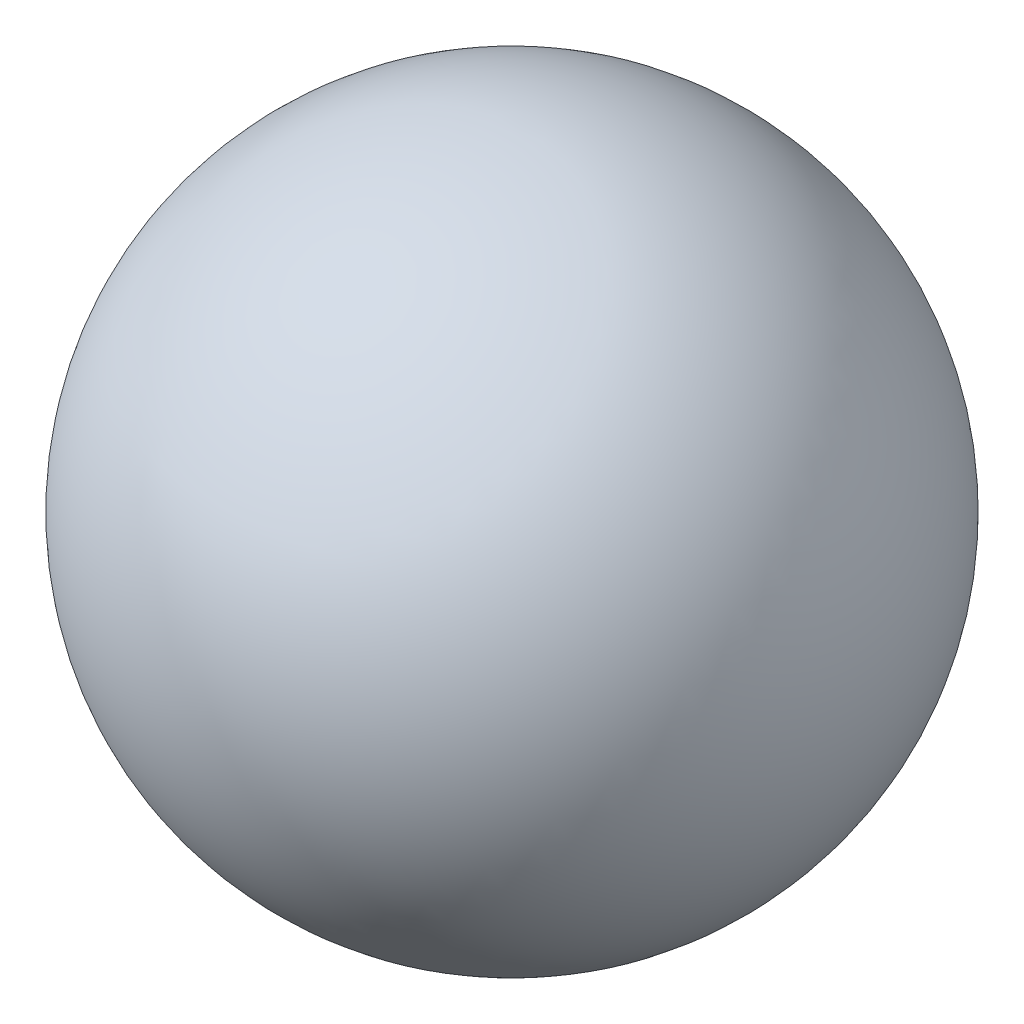
ISO-10303-21;
HEADER;
FILE_DESCRIPTION(('STEP AP214'),'2;1');
FILE_NAME('part.step','',(''),(''),'','','');
FILE_SCHEMA(('AUTOMOTIVE_DESIGN { 1 0 10303 214 1 1 1 1 }'));
ENDSEC;
DATA;
#1=APPLICATION_CONTEXT('core data for automotive mechanical design processes');
#2=APPLICATION_PROTOCOL_DEFINITION('international standard','automotive_design',2000,#1);
#3=PRODUCT_CONTEXT('',#1,'mechanical');
#4=PRODUCT('Part','Part','',(#3));
#5=PRODUCT_RELATED_PRODUCT_CATEGORY('part','',(#4));
#6=PRODUCT_DEFINITION_FORMATION('','',#4);
#7=PRODUCT_DEFINITION_CONTEXT('part definition',#1,'design');
#8=PRODUCT_DEFINITION('design','',#6,#7);
#9=PRODUCT_DEFINITION_SHAPE('','',#8);
#10=(LENGTH_UNIT() NAMED_UNIT(*) SI_UNIT(.MILLI.,.METRE.));
#11=(NAMED_UNIT(*) PLANE_ANGLE_UNIT() SI_UNIT($,.RADIAN.));
#12=(NAMED_UNIT(*) SI_UNIT($,.STERADIAN.) SOLID_ANGLE_UNIT());
#13=UNCERTAINTY_MEASURE_WITH_UNIT(LENGTH_MEASURE(1.E-05),#10,'distance_accuracy_value','');
#14=(GEOMETRIC_REPRESENTATION_CONTEXT(3) GLOBAL_UNCERTAINTY_ASSIGNED_CONTEXT((#13)) GLOBAL_UNIT_ASSIGNED_CONTEXT((#10,
#11,#12)) REPRESENTATION_CONTEXT('',''));
#15=CARTESIAN_POINT('',(0.,0.,0.));
#16=DIRECTION('',(0.,0.,1.));
#17=DIRECTION('',(1.,0.,0.));
#18=AXIS2_PLACEMENT_3D('',#15,#16,#17);
#19=CARTESIAN_POINT('',(0.,0.,0.));
#20=DIRECTION('',(0.,-1.,0.));
#21=DIRECTION('',(-1.,0.,0.));
#22=AXIS2_PLACEMENT_3D('',#19,#20,#21);
#23=SPHERICAL_SURFACE('',#22,40.7593331933617);
#24=CARTESIAN_POINT('',(0.,-40.7593331933617,0.));
#25=VERTEX_POINT('',#24);
#26=VERTEX_LOOP('',#25);
#27=FACE_BOUND('',#26,.T.);
#28=ADVANCED_FACE('F32',(#27),#23,.T.);
#29=CLOSED_SHELL('',(#28));
#30=CARTESIAN_POINT('',(0.,0.,0.));
#31=DIRECTION('',(0.,-1.,0.));
#32=DIRECTION('',(-1.,0.,0.));
#33=AXIS2_PLACEMENT_3D('',#30,#31,#32);
#34=SPHERICAL_SURFACE('',#33,36.1151882274876);
#35=CARTESIAN_POINT('',(0.,-36.1151882274876,0.));
#36=VERTEX_POINT('',#35);
#37=VERTEX_LOOP('',#36);
#38=FACE_BOUND('',#37,.T.);
#39=ADVANCED_FACE('F34',(#38),#34,.F.);
#40=CLOSED_SHELL('',(#39));
#41=ORIENTED_CLOSED_SHELL('',*,#40,.T.);
#42=BREP_WITH_VOIDS('B2',#29,(#41));
#43=ADVANCED_BREP_SHAPE_REPRESENTATION('',(#18,#42),#14);
#44=SHAPE_DEFINITION_REPRESENTATION(#9,#43);
ENDSEC;
END-ISO-10303-21;
